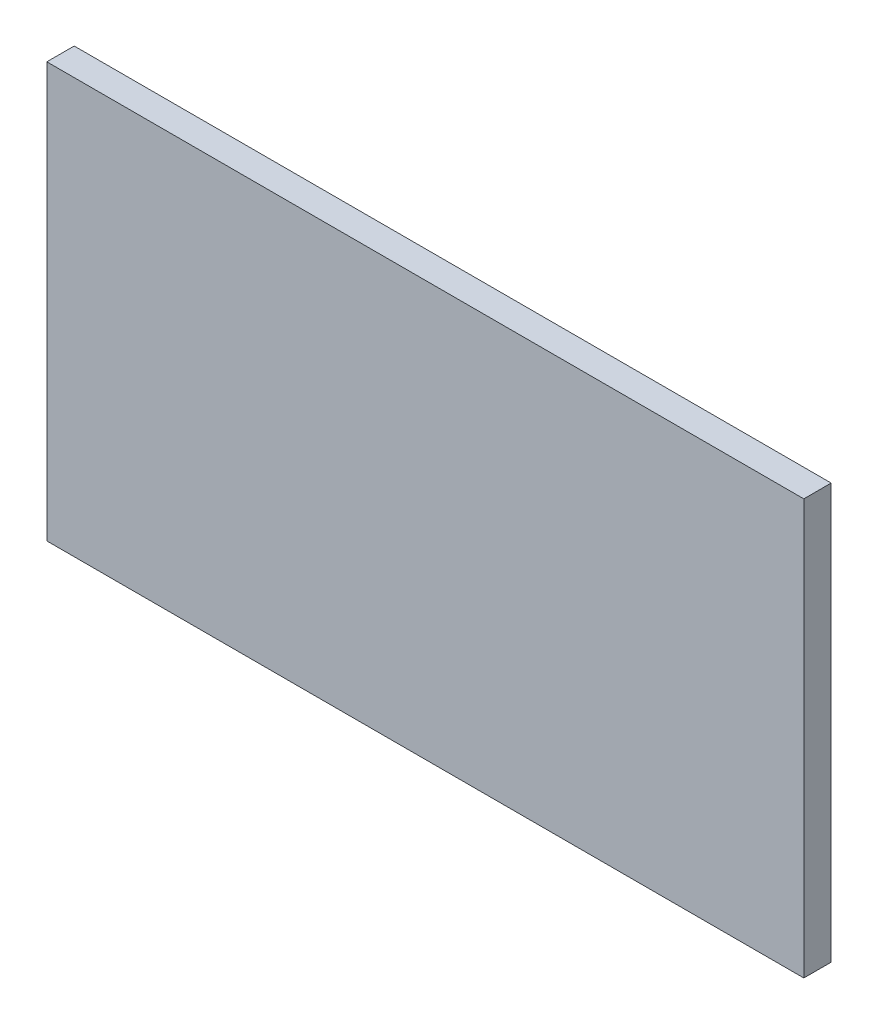
ISO-10303-21;
HEADER;
FILE_DESCRIPTION(('STEP AP214'),'2;1');
FILE_NAME('part.step','',(''),(''),'','','');
FILE_SCHEMA(('AUTOMOTIVE_DESIGN { 1 0 10303 214 1 1 1 1 }'));
ENDSEC;
DATA;
#1=APPLICATION_CONTEXT('core data for automotive mechanical design processes');
#2=APPLICATION_PROTOCOL_DEFINITION('international standard','automotive_design',2000,#1);
#3=PRODUCT_CONTEXT('',#1,'mechanical');
#4=PRODUCT('Part','Part','',(#3));
#5=PRODUCT_RELATED_PRODUCT_CATEGORY('part','',(#4));
#6=PRODUCT_DEFINITION_FORMATION('','',#4);
#7=PRODUCT_DEFINITION_CONTEXT('part definition',#1,'design');
#8=PRODUCT_DEFINITION('design','',#6,#7);
#9=PRODUCT_DEFINITION_SHAPE('','',#8);
#10=(LENGTH_UNIT() NAMED_UNIT(*) SI_UNIT(.MILLI.,.METRE.));
#11=(NAMED_UNIT(*) PLANE_ANGLE_UNIT() SI_UNIT($,.RADIAN.));
#12=(NAMED_UNIT(*) SI_UNIT($,.STERADIAN.) SOLID_ANGLE_UNIT());
#13=UNCERTAINTY_MEASURE_WITH_UNIT(LENGTH_MEASURE(1.E-05),#10,'distance_accuracy_value','');
#14=(GEOMETRIC_REPRESENTATION_CONTEXT(3) GLOBAL_UNCERTAINTY_ASSIGNED_CONTEXT((#13)) GLOBAL_UNIT_ASSIGNED_CONTEXT((#10,
#11,#12)) REPRESENTATION_CONTEXT('',''));
#15=CARTESIAN_POINT('',(0.,0.,0.));
#16=DIRECTION('',(0.,0.,1.));
#17=DIRECTION('',(1.,0.,0.));
#18=AXIS2_PLACEMENT_3D('',#15,#16,#17);
#19=CARTESIAN_POINT('',(23.25,6.79999999999998,-0.25));
#20=DIRECTION('',(0.,0.,1.));
#21=DIRECTION('',(1.,0.,0.));
#22=AXIS2_PLACEMENT_3D('',#19,#20,#21);
#23=CYLINDRICAL_SURFACE('',#22,0.650000000000001);
#24=CARTESIAN_POINT('',(23.25,6.79999999999998,-0.25));
#25=DIRECTION('',(0.,0.,-1.));
#26=DIRECTION('',(-1.,0.,0.));
#27=AXIS2_PLACEMENT_3D('',#24,#25,#26);
#28=CIRCLE('',#27,0.650000000000001);
#29=CARTESIAN_POINT('',(22.6,6.79999999999998,-0.25));
#30=VERTEX_POINT('',#29);
#31=EDGE_CURVE('E11',#30,#30,#28,.F.);
#32=ORIENTED_EDGE('',*,*,#31,.T.);
#33=EDGE_LOOP('',(#32));
#34=FACE_BOUND('',#33,.T.);
#35=CARTESIAN_POINT('',(23.25,6.79999999999998,0.));
#36=DIRECTION('',(0.,0.,-1.));
#37=DIRECTION('',(-1.,0.,0.));
#38=AXIS2_PLACEMENT_3D('',#35,#36,#37);
#39=CIRCLE('',#38,0.650000000000001);
#40=CARTESIAN_POINT('',(22.6,6.79999999999998,0.));
#41=VERTEX_POINT('',#40);
#42=EDGE_CURVE('E47',#41,#41,#39,.F.);
#43=ORIENTED_EDGE('',*,*,#42,.F.);
#44=EDGE_LOOP('',(#43));
#45=FACE_BOUND('',#44,.T.);
#46=ADVANCED_FACE('F44',(#34,#45),#23,.T.);
#47=CARTESIAN_POINT('',(0.,0.,-0.25));
#48=DIRECTION('',(0.,0.,-1.));
#49=DIRECTION('',(-1.,0.,0.));
#50=AXIS2_PLACEMENT_3D('',#47,#48,#49);
#51=PLANE('',#50);
#52=ORIENTED_EDGE('',*,*,#31,.F.);
#53=EDGE_LOOP('',(#52));
#54=FACE_BOUND('',#53,.T.);
#55=ADVANCED_FACE('F59',(#54),#51,.T.);
#56=CARTESIAN_POINT('',(0.,0.,0.));
#57=DIRECTION('',(0.,0.,-1.));
#58=DIRECTION('',(-1.,0.,0.));
#59=AXIS2_PLACEMENT_3D('',#56,#57,#58);
#60=PLANE('',#59);
#61=ORIENTED_EDGE('',*,*,#42,.T.);
#62=EDGE_LOOP('',(#61));
#63=FACE_BOUND('',#62,.T.);
#64=ADVANCED_FACE('F56',(#63),#60,.F.);
#65=CLOSED_SHELL('',(#46,#55,#64));
#66=MANIFOLD_SOLID_BREP('B2',#65);
#67=CARTESIAN_POINT('',(21.5,6.79999999999999,-0.25));
#68=DIRECTION('',(0.,0.,1.));
#69=DIRECTION('',(1.,0.,0.));
#70=AXIS2_PLACEMENT_3D('',#67,#68,#69);
#71=CYLINDRICAL_SURFACE('',#70,0.650000000000001);
#72=CARTESIAN_POINT('',(21.5,6.79999999999999,-0.25));
#73=DIRECTION('',(0.,0.,-1.));
#74=DIRECTION('',(-1.,0.,0.));
#75=AXIS2_PLACEMENT_3D('',#72,#73,#74);
#76=CIRCLE('',#75,0.650000000000001);
#77=CARTESIAN_POINT('',(20.85,6.79999999999999,-0.25));
#78=VERTEX_POINT('',#77);
#79=EDGE_CURVE('E43',#78,#78,#76,.F.);
#80=ORIENTED_EDGE('',*,*,#79,.T.);
#81=EDGE_LOOP('',(#80));
#82=FACE_BOUND('',#81,.T.);
#83=CARTESIAN_POINT('',(21.5,6.79999999999999,0.));
#84=DIRECTION('',(0.,0.,-1.));
#85=DIRECTION('',(-1.,0.,0.));
#86=AXIS2_PLACEMENT_3D('',#83,#84,#85);
#87=CIRCLE('',#86,0.650000000000001);
#88=CARTESIAN_POINT('',(20.85,6.79999999999999,0.));
#89=VERTEX_POINT('',#88);
#90=EDGE_CURVE('E96',#89,#89,#87,.F.);
#91=ORIENTED_EDGE('',*,*,#90,.F.);
#92=EDGE_LOOP('',(#91));
#93=FACE_BOUND('',#92,.T.);
#94=ADVANCED_FACE('F93',(#82,#93),#71,.T.);
#95=CARTESIAN_POINT('',(0.,0.,-0.25));
#96=DIRECTION('',(0.,0.,-1.));
#97=DIRECTION('',(-1.,0.,0.));
#98=AXIS2_PLACEMENT_3D('',#95,#96,#97);
#99=PLANE('',#98);
#100=ORIENTED_EDGE('',*,*,#79,.F.);
#101=EDGE_LOOP('',(#100));
#102=FACE_BOUND('',#101,.T.);
#103=ADVANCED_FACE('F108',(#102),#99,.T.);
#104=CARTESIAN_POINT('',(0.,0.,0.));
#105=DIRECTION('',(0.,0.,-1.));
#106=DIRECTION('',(-1.,0.,0.));
#107=AXIS2_PLACEMENT_3D('',#104,#105,#106);
#108=PLANE('',#107);
#109=ORIENTED_EDGE('',*,*,#90,.T.);
#110=EDGE_LOOP('',(#109));
#111=FACE_BOUND('',#110,.T.);
#112=ADVANCED_FACE('F105',(#111),#108,.F.);
#113=CLOSED_SHELL('',(#94,#103,#112));
#114=MANIFOLD_SOLID_BREP('B6',#113);
#115=CARTESIAN_POINT('',(21.5,5.04999999999999,-0.25));
#116=DIRECTION('',(0.,0.,1.));
#117=DIRECTION('',(1.,0.,0.));
#118=AXIS2_PLACEMENT_3D('',#115,#116,#117);
#119=CYLINDRICAL_SURFACE('',#118,0.650000000000001);
#120=CARTESIAN_POINT('',(21.5,5.04999999999999,-0.25));
#121=DIRECTION('',(0.,0.,-1.));
#122=DIRECTION('',(-1.,0.,0.));
#123=AXIS2_PLACEMENT_3D('',#120,#121,#122);
#124=CIRCLE('',#123,0.650000000000001);
#125=CARTESIAN_POINT('',(20.85,5.04999999999999,-0.25));
#126=VERTEX_POINT('',#125);
#127=EDGE_CURVE('E92',#126,#126,#124,.F.);
#128=ORIENTED_EDGE('',*,*,#127,.T.);
#129=EDGE_LOOP('',(#128));
#130=FACE_BOUND('',#129,.T.);
#131=CARTESIAN_POINT('',(21.5,5.04999999999999,0.));
#132=DIRECTION('',(0.,0.,-1.));
#133=DIRECTION('',(-1.,0.,0.));
#134=AXIS2_PLACEMENT_3D('',#131,#132,#133);
#135=CIRCLE('',#134,0.650000000000001);
#136=CARTESIAN_POINT('',(20.85,5.04999999999999,0.));
#137=VERTEX_POINT('',#136);
#138=EDGE_CURVE('E145',#137,#137,#135,.F.);
#139=ORIENTED_EDGE('',*,*,#138,.F.);
#140=EDGE_LOOP('',(#139));
#141=FACE_BOUND('',#140,.T.);
#142=ADVANCED_FACE('F142',(#130,#141),#119,.T.);
#143=CARTESIAN_POINT('',(0.,0.,-0.25));
#144=DIRECTION('',(0.,0.,-1.));
#145=DIRECTION('',(-1.,0.,0.));
#146=AXIS2_PLACEMENT_3D('',#143,#144,#145);
#147=PLANE('',#146);
#148=ORIENTED_EDGE('',*,*,#127,.F.);
#149=EDGE_LOOP('',(#148));
#150=FACE_BOUND('',#149,.T.);
#151=ADVANCED_FACE('F157',(#150),#147,.T.);
#152=CARTESIAN_POINT('',(0.,0.,0.));
#153=DIRECTION('',(0.,0.,-1.));
#154=DIRECTION('',(-1.,0.,0.));
#155=AXIS2_PLACEMENT_3D('',#152,#153,#154);
#156=PLANE('',#155);
#157=ORIENTED_EDGE('',*,*,#138,.T.);
#158=EDGE_LOOP('',(#157));
#159=FACE_BOUND('',#158,.T.);
#160=ADVANCED_FACE('F154',(#159),#156,.F.);
#161=CLOSED_SHELL('',(#142,#151,#160));
#162=MANIFOLD_SOLID_BREP('B38',#161);
#163=CARTESIAN_POINT('',(23.25,5.04999999999998,-0.25));
#164=DIRECTION('',(0.,0.,1.));
#165=DIRECTION('',(1.,0.,0.));
#166=AXIS2_PLACEMENT_3D('',#163,#164,#165);
#167=CYLINDRICAL_SURFACE('',#166,0.650000000000001);
#168=CARTESIAN_POINT('',(23.25,5.04999999999998,-0.25));
#169=DIRECTION('',(0.,0.,-1.));
#170=DIRECTION('',(-1.,0.,0.));
#171=AXIS2_PLACEMENT_3D('',#168,#169,#170);
#172=CIRCLE('',#171,0.650000000000001);
#173=CARTESIAN_POINT('',(22.6,5.04999999999998,-0.25));
#174=VERTEX_POINT('',#173);
#175=EDGE_CURVE('E141',#174,#174,#172,.F.);
#176=ORIENTED_EDGE('',*,*,#175,.T.);
#177=EDGE_LOOP('',(#176));
#178=FACE_BOUND('',#177,.T.);
#179=CARTESIAN_POINT('',(23.25,5.04999999999998,0.));
#180=DIRECTION('',(0.,0.,-1.));
#181=DIRECTION('',(-1.,0.,0.));
#182=AXIS2_PLACEMENT_3D('',#179,#180,#181);
#183=CIRCLE('',#182,0.650000000000001);
#184=CARTESIAN_POINT('',(22.6,5.04999999999998,0.));
#185=VERTEX_POINT('',#184);
#186=EDGE_CURVE('E194',#185,#185,#183,.F.);
#187=ORIENTED_EDGE('',*,*,#186,.F.);
#188=EDGE_LOOP('',(#187));
#189=FACE_BOUND('',#188,.T.);
#190=ADVANCED_FACE('F191',(#178,#189),#167,.T.);
#191=CARTESIAN_POINT('',(0.,0.,-0.25));
#192=DIRECTION('',(0.,0.,-1.));
#193=DIRECTION('',(-1.,0.,0.));
#194=AXIS2_PLACEMENT_3D('',#191,#192,#193);
#195=PLANE('',#194);
#196=ORIENTED_EDGE('',*,*,#175,.F.);
#197=EDGE_LOOP('',(#196));
#198=FACE_BOUND('',#197,.T.);
#199=ADVANCED_FACE('F206',(#198),#195,.T.);
#200=CARTESIAN_POINT('',(0.,0.,0.));
#201=DIRECTION('',(0.,0.,-1.));
#202=DIRECTION('',(-1.,0.,0.));
#203=AXIS2_PLACEMENT_3D('',#200,#201,#202);
#204=PLANE('',#203);
#205=ORIENTED_EDGE('',*,*,#186,.T.);
#206=EDGE_LOOP('',(#205));
#207=FACE_BOUND('',#206,.T.);
#208=ADVANCED_FACE('F203',(#207),#204,.F.);
#209=CLOSED_SHELL('',(#190,#199,#208));
#210=MANIFOLD_SOLID_BREP('B87',#209);
#211=CARTESIAN_POINT('',(23.25,3.29999999999998,-0.25));
#212=DIRECTION('',(0.,0.,1.));
#213=DIRECTION('',(1.,0.,0.));
#214=AXIS2_PLACEMENT_3D('',#211,#212,#213);
#215=CYLINDRICAL_SURFACE('',#214,0.650000000000001);
#216=CARTESIAN_POINT('',(23.25,3.29999999999998,-0.25));
#217=DIRECTION('',(0.,0.,-1.));
#218=DIRECTION('',(-1.,0.,0.));
#219=AXIS2_PLACEMENT_3D('',#216,#217,#218);
#220=CIRCLE('',#219,0.650000000000001);
#221=CARTESIAN_POINT('',(22.6,3.29999999999998,-0.25));
#222=VERTEX_POINT('',#221);
#223=EDGE_CURVE('E190',#222,#222,#220,.F.);
#224=ORIENTED_EDGE('',*,*,#223,.T.);
#225=EDGE_LOOP('',(#224));
#226=FACE_BOUND('',#225,.T.);
#227=CARTESIAN_POINT('',(23.25,3.29999999999998,0.));
#228=DIRECTION('',(0.,0.,-1.));
#229=DIRECTION('',(-1.,0.,0.));
#230=AXIS2_PLACEMENT_3D('',#227,#228,#229);
#231=CIRCLE('',#230,0.650000000000001);
#232=CARTESIAN_POINT('',(22.6,3.29999999999998,0.));
#233=VERTEX_POINT('',#232);
#234=EDGE_CURVE('E243',#233,#233,#231,.F.);
#235=ORIENTED_EDGE('',*,*,#234,.F.);
#236=EDGE_LOOP('',(#235));
#237=FACE_BOUND('',#236,.T.);
#238=ADVANCED_FACE('F240',(#226,#237),#215,.T.);
#239=CARTESIAN_POINT('',(0.,0.,-0.25));
#240=DIRECTION('',(0.,0.,-1.));
#241=DIRECTION('',(-1.,0.,0.));
#242=AXIS2_PLACEMENT_3D('',#239,#240,#241);
#243=PLANE('',#242);
#244=ORIENTED_EDGE('',*,*,#223,.F.);
#245=EDGE_LOOP('',(#244));
#246=FACE_BOUND('',#245,.T.);
#247=ADVANCED_FACE('F255',(#246),#243,.T.);
#248=CARTESIAN_POINT('',(0.,0.,0.));
#249=DIRECTION('',(0.,0.,-1.));
#250=DIRECTION('',(-1.,0.,0.));
#251=AXIS2_PLACEMENT_3D('',#248,#249,#250);
#252=PLANE('',#251);
#253=ORIENTED_EDGE('',*,*,#234,.T.);
#254=EDGE_LOOP('',(#253));
#255=FACE_BOUND('',#254,.T.);
#256=ADVANCED_FACE('F252',(#255),#252,.F.);
#257=CLOSED_SHELL('',(#238,#247,#256));
#258=MANIFOLD_SOLID_BREP('B136',#257);
#259=CARTESIAN_POINT('',(21.5,3.29999999999999,-0.25));
#260=DIRECTION('',(0.,0.,1.));
#261=DIRECTION('',(1.,0.,0.));
#262=AXIS2_PLACEMENT_3D('',#259,#260,#261);
#263=CYLINDRICAL_SURFACE('',#262,0.650000000000001);
#264=CARTESIAN_POINT('',(21.5,3.29999999999999,-0.25));
#265=DIRECTION('',(0.,0.,-1.));
#266=DIRECTION('',(-1.,0.,0.));
#267=AXIS2_PLACEMENT_3D('',#264,#265,#266);
#268=CIRCLE('',#267,0.650000000000001);
#269=CARTESIAN_POINT('',(20.85,3.29999999999999,-0.25));
#270=VERTEX_POINT('',#269);
#271=EDGE_CURVE('E239',#270,#270,#268,.F.);
#272=ORIENTED_EDGE('',*,*,#271,.T.);
#273=EDGE_LOOP('',(#272));
#274=FACE_BOUND('',#273,.T.);
#275=CARTESIAN_POINT('',(21.5,3.29999999999999,0.));
#276=DIRECTION('',(0.,0.,-1.));
#277=DIRECTION('',(-1.,0.,0.));
#278=AXIS2_PLACEMENT_3D('',#275,#276,#277);
#279=CIRCLE('',#278,0.650000000000001);
#280=CARTESIAN_POINT('',(20.85,3.29999999999999,0.));
#281=VERTEX_POINT('',#280);
#282=EDGE_CURVE('E293',#281,#281,#279,.F.);
#283=ORIENTED_EDGE('',*,*,#282,.F.);
#284=EDGE_LOOP('',(#283));
#285=FACE_BOUND('',#284,.T.);
#286=ADVANCED_FACE('F290',(#274,#285),#263,.T.);
#287=CARTESIAN_POINT('',(0.,0.,-0.25));
#288=DIRECTION('',(0.,0.,-1.));
#289=DIRECTION('',(-1.,0.,0.));
#290=AXIS2_PLACEMENT_3D('',#287,#288,#289);
#291=PLANE('',#290);
#292=ORIENTED_EDGE('',*,*,#271,.F.);
#293=EDGE_LOOP('',(#292));
#294=FACE_BOUND('',#293,.T.);
#295=ADVANCED_FACE('F305',(#294),#291,.T.);
#296=CARTESIAN_POINT('',(0.,0.,0.));
#297=DIRECTION('',(0.,0.,-1.));
#298=DIRECTION('',(-1.,0.,0.));
#299=AXIS2_PLACEMENT_3D('',#296,#297,#298);
#300=PLANE('',#299);
#301=ORIENTED_EDGE('',*,*,#282,.T.);
#302=EDGE_LOOP('',(#301));
#303=FACE_BOUND('',#302,.T.);
#304=ADVANCED_FACE('F302',(#303),#300,.F.);
#305=CLOSED_SHELL('',(#286,#295,#304));
#306=MANIFOLD_SOLID_BREP('B185',#305);
#307=CARTESIAN_POINT('',(0.,0.,0.));
#308=DIRECTION('',(0.,0.,-1.));
#309=DIRECTION('',(-1.,0.,0.));
#310=AXIS2_PLACEMENT_3D('',#307,#308,#309);
#311=PLANE('',#310);
#312=DIRECTION('',(0.,1.,0.));
#313=VECTOR('',#312,1.);
#314=CARTESIAN_POINT('',(0.,0.,0.));
#315=LINE('',#314,#313);
#316=CARTESIAN_POINT('',(0.,0.,0.));
#317=VERTEX_POINT('',#316);
#318=CARTESIAN_POINT('',(0.,22.75,0.));
#319=VERTEX_POINT('',#318);
#320=EDGE_CURVE('E413',#317,#319,#315,.T.);
#321=ORIENTED_EDGE('',*,*,#320,.T.);
#322=DIRECTION('',(1.,0.,0.));
#323=VECTOR('',#322,1.);
#324=CARTESIAN_POINT('',(0.,22.75,0.));
#325=LINE('',#324,#323);
#326=CARTESIAN_POINT('',(41.5,22.75,0.));
#327=VERTEX_POINT('',#326);
#328=EDGE_CURVE('E451',#319,#327,#325,.T.);
#329=ORIENTED_EDGE('',*,*,#328,.T.);
#330=DIRECTION('',(0.,1.,0.));
#331=VECTOR('',#330,1.);
#332=CARTESIAN_POINT('',(41.5,0.,0.));
#333=LINE('',#332,#331);
#334=CARTESIAN_POINT('',(41.5,0.,0.));
#335=VERTEX_POINT('',#334);
#336=EDGE_CURVE('E454',#335,#327,#333,.T.);
#337=ORIENTED_EDGE('',*,*,#336,.F.);
#338=DIRECTION('',(1.,0.,0.));
#339=VECTOR('',#338,1.);
#340=CARTESIAN_POINT('',(0.,0.,0.));
#341=LINE('',#340,#339);
#342=EDGE_CURVE('E441',#317,#335,#341,.T.);
#343=ORIENTED_EDGE('',*,*,#342,.F.);
#344=EDGE_LOOP('',(#321,#329,#337,#343));
#345=FACE_BOUND('',#344,.T.);
#346=DIRECTION('',(1.,0.,0.));
#347=VECTOR('',#346,1.);
#348=CARTESIAN_POINT('',(5.5,15.25,0.));
#349=LINE('',#348,#347);
#350=CARTESIAN_POINT('',(5.5,15.25,0.));
#351=VERTEX_POINT('',#350);
#352=CARTESIAN_POINT('',(9.26,15.25,0.));
#353=VERTEX_POINT('',#352);
#354=EDGE_CURVE('E411',#351,#353,#349,.T.);
#355=ORIENTED_EDGE('',*,*,#354,.F.);
#356=DIRECTION('',(0.,1.,0.));
#357=VECTOR('',#356,1.);
#358=CARTESIAN_POINT('',(5.5,12.25,0.));
#359=LINE('',#358,#357);
#360=CARTESIAN_POINT('',(5.5,12.25,0.));
#361=VERTEX_POINT('',#360);
#362=EDGE_CURVE('E417',#361,#351,#359,.T.);
#363=ORIENTED_EDGE('',*,*,#362,.F.);
#364=DIRECTION('',(-1.,0.,0.));
#365=VECTOR('',#364,1.);
#366=CARTESIAN_POINT('',(5.5,12.25,0.));
#367=LINE('',#366,#365);
#368=CARTESIAN_POINT('',(9.26,12.25,0.));
#369=VERTEX_POINT('',#368);
#370=EDGE_CURVE('E428',#369,#361,#367,.T.);
#371=ORIENTED_EDGE('',*,*,#370,.F.);
#372=DIRECTION('',(0.,-1.,0.));
#373=VECTOR('',#372,1.);
#374=CARTESIAN_POINT('',(9.26,12.25,0.));
#375=LINE('',#374,#373);
#376=EDGE_CURVE('E426',#353,#369,#375,.T.);
#377=ORIENTED_EDGE('',*,*,#376,.F.);
#378=EDGE_LOOP('',(#355,#363,#371,#377));
#379=FACE_BOUND('',#378,.T.);
#380=ADVANCED_FACE('F331',(#345,#379),#311,.T.);
#381=CARTESIAN_POINT('',(0.,0.,1.5));
#382=DIRECTION('',(-1.,0.,0.));
#383=DIRECTION('',(0.,0.,1.));
#384=AXIS2_PLACEMENT_3D('',#381,#382,#383);
#385=PLANE('',#384);
#386=ORIENTED_EDGE('',*,*,#320,.F.);
#387=DIRECTION('',(0.,0.,-1.));
#388=VECTOR('',#387,1.);
#389=CARTESIAN_POINT('',(0.,0.,1.5));
#390=LINE('',#389,#388);
#391=CARTESIAN_POINT('',(0.,0.,1.5));
#392=VERTEX_POINT('',#391);
#393=EDGE_CURVE('E458',#392,#317,#390,.T.);
#394=ORIENTED_EDGE('',*,*,#393,.F.);
#395=DIRECTION('',(0.,1.,0.));
#396=VECTOR('',#395,1.);
#397=CARTESIAN_POINT('',(0.,0.,1.5));
#398=LINE('',#397,#396);
#399=CARTESIAN_POINT('',(0.,22.75,1.5));
#400=VERTEX_POINT('',#399);
#401=EDGE_CURVE('E437',#392,#400,#398,.T.);
#402=ORIENTED_EDGE('',*,*,#401,.T.);
#403=DIRECTION('',(0.,0.,-1.));
#404=VECTOR('',#403,1.);
#405=CARTESIAN_POINT('',(0.,22.75,1.5));
#406=LINE('',#405,#404);
#407=EDGE_CURVE('E448',#400,#319,#406,.T.);
#408=ORIENTED_EDGE('',*,*,#407,.T.);
#409=EDGE_LOOP('',(#386,#394,#402,#408));
#410=FACE_BOUND('',#409,.T.);
#411=ADVANCED_FACE('F516',(#410),#385,.T.);
#412=CARTESIAN_POINT('',(0.,0.,1.5));
#413=DIRECTION('',(0.,1.,0.));
#414=DIRECTION('',(0.,0.,1.));
#415=AXIS2_PLACEMENT_3D('',#412,#413,#414);
#416=PLANE('',#415);
#417=ORIENTED_EDGE('',*,*,#342,.T.);
#418=DIRECTION('',(0.,0.,-1.));
#419=VECTOR('',#418,1.);
#420=CARTESIAN_POINT('',(41.5,0.,1.5));
#421=LINE('',#420,#419);
#422=CARTESIAN_POINT('',(41.5,0.,1.5));
#423=VERTEX_POINT('',#422);
#424=EDGE_CURVE('E461',#423,#335,#421,.T.);
#425=ORIENTED_EDGE('',*,*,#424,.F.);
#426=DIRECTION('',(1.,0.,0.));
#427=VECTOR('',#426,1.);
#428=CARTESIAN_POINT('',(0.,0.,1.5));
#429=LINE('',#428,#427);
#430=EDGE_CURVE('E446',#392,#423,#429,.T.);
#431=ORIENTED_EDGE('',*,*,#430,.F.);
#432=ORIENTED_EDGE('',*,*,#393,.T.);
#433=EDGE_LOOP('',(#417,#425,#431,#432));
#434=FACE_BOUND('',#433,.T.);
#435=ADVANCED_FACE('F522',(#434),#416,.F.);
#436=CARTESIAN_POINT('',(41.5,0.,1.5));
#437=DIRECTION('',(-1.,0.,0.));
#438=DIRECTION('',(0.,0.,1.));
#439=AXIS2_PLACEMENT_3D('',#436,#437,#438);
#440=PLANE('',#439);
#441=ORIENTED_EDGE('',*,*,#336,.T.);
#442=DIRECTION('',(0.,0.,-1.));
#443=VECTOR('',#442,1.);
#444=CARTESIAN_POINT('',(41.5,22.75,1.5));
#445=LINE('',#444,#443);
#446=CARTESIAN_POINT('',(41.5,22.75,1.5));
#447=VERTEX_POINT('',#446);
#448=EDGE_CURVE('E464',#447,#327,#445,.T.);
#449=ORIENTED_EDGE('',*,*,#448,.F.);
#450=DIRECTION('',(0.,1.,0.));
#451=VECTOR('',#450,1.);
#452=CARTESIAN_POINT('',(41.5,0.,1.5));
#453=LINE('',#452,#451);
#454=EDGE_CURVE('E444',#423,#447,#453,.T.);
#455=ORIENTED_EDGE('',*,*,#454,.F.);
#456=ORIENTED_EDGE('',*,*,#424,.T.);
#457=EDGE_LOOP('',(#441,#449,#455,#456));
#458=FACE_BOUND('',#457,.T.);
#459=ADVANCED_FACE('F531',(#458),#440,.F.);
#460=CARTESIAN_POINT('',(0.,22.75,1.5));
#461=DIRECTION('',(0.,1.,0.));
#462=DIRECTION('',(0.,0.,1.));
#463=AXIS2_PLACEMENT_3D('',#460,#461,#462);
#464=PLANE('',#463);
#465=ORIENTED_EDGE('',*,*,#328,.F.);
#466=ORIENTED_EDGE('',*,*,#407,.F.);
#467=DIRECTION('',(1.,0.,0.));
#468=VECTOR('',#467,1.);
#469=CARTESIAN_POINT('',(0.,22.75,1.5));
#470=LINE('',#469,#468);
#471=EDGE_CURVE('E440',#400,#447,#470,.T.);
#472=ORIENTED_EDGE('',*,*,#471,.T.);
#473=ORIENTED_EDGE('',*,*,#448,.T.);
#474=EDGE_LOOP('',(#465,#466,#472,#473));
#475=FACE_BOUND('',#474,.T.);
#476=ADVANCED_FACE('F535',(#475),#464,.T.);
#477=CARTESIAN_POINT('',(0.,0.,1.5));
#478=DIRECTION('',(0.,0.,-1.));
#479=DIRECTION('',(-1.,0.,0.));
#480=AXIS2_PLACEMENT_3D('',#477,#478,#479);
#481=PLANE('',#480);
#482=ORIENTED_EDGE('',*,*,#401,.F.);
#483=ORIENTED_EDGE('',*,*,#430,.T.);
#484=ORIENTED_EDGE('',*,*,#454,.T.);
#485=ORIENTED_EDGE('',*,*,#471,.F.);
#486=EDGE_LOOP('',(#482,#483,#484,#485));
#487=FACE_BOUND('',#486,.T.);
#488=ADVANCED_FACE('F527',(#487),#481,.F.);
#489=CARTESIAN_POINT('',(5.5,12.25,-1.1));
#490=DIRECTION('',(1.,0.,0.));
#491=DIRECTION('',(0.,0.,-1.));
#492=AXIS2_PLACEMENT_3D('',#489,#490,#491);
#493=PLANE('',#492);
#494=DIRECTION('',(0.,0.,1.));
#495=VECTOR('',#494,1.);
#496=CARTESIAN_POINT('',(5.5,15.25,-1.1));
#497=LINE('',#496,#495);
#498=CARTESIAN_POINT('',(5.5,15.25,-0.6));
#499=VERTEX_POINT('',#498);
#500=EDGE_CURVE('E407',#499,#351,#497,.T.);
#501=ORIENTED_EDGE('',*,*,#500,.F.);
#502=DIRECTION('',(0.,1.,0.));
#503=VECTOR('',#502,1.);
#504=CARTESIAN_POINT('',(5.5,12.25,-0.6));
#505=LINE('',#504,#503);
#506=CARTESIAN_POINT('',(5.5,12.25,-0.6));
#507=VERTEX_POINT('',#506);
#508=EDGE_CURVE('E340',#499,#507,#505,.F.);
#509=ORIENTED_EDGE('',*,*,#508,.T.);
#510=DIRECTION('',(0.,0.,1.));
#511=VECTOR('',#510,1.);
#512=CARTESIAN_POINT('',(5.5,12.25,-1.1));
#513=LINE('',#512,#511);
#514=EDGE_CURVE('E419',#507,#361,#513,.T.);
#515=ORIENTED_EDGE('',*,*,#514,.T.);
#516=ORIENTED_EDGE('',*,*,#362,.T.);
#517=EDGE_LOOP('',(#501,#509,#515,#516));
#518=FACE_BOUND('',#517,.T.);
#519=ADVANCED_FACE('F418',(#518),#493,.F.);
#520=CARTESIAN_POINT('',(5.5,15.25,-1.1));
#521=DIRECTION('',(0.,-1.,0.));
#522=DIRECTION('',(1.,0.,0.));
#523=AXIS2_PLACEMENT_3D('',#520,#521,#522);
#524=PLANE('',#523);
#525=DIRECTION('',(0.,0.,1.));
#526=VECTOR('',#525,1.);
#527=CARTESIAN_POINT('',(9.26,15.25,-1.1));
#528=LINE('',#527,#526);
#529=CARTESIAN_POINT('',(9.26,15.25,-0.6));
#530=VERTEX_POINT('',#529);
#531=EDGE_CURVE('E414',#530,#353,#528,.T.);
#532=ORIENTED_EDGE('',*,*,#531,.F.);
#533=DIRECTION('',(1.,0.,0.));
#534=VECTOR('',#533,1.);
#535=CARTESIAN_POINT('',(5.5,15.25,-0.6));
#536=LINE('',#535,#534);
#537=EDGE_CURVE('E355',#530,#499,#536,.F.);
#538=ORIENTED_EDGE('',*,*,#537,.T.);
#539=ORIENTED_EDGE('',*,*,#500,.T.);
#540=ORIENTED_EDGE('',*,*,#354,.T.);
#541=EDGE_LOOP('',(#532,#538,#539,#540));
#542=FACE_BOUND('',#541,.T.);
#543=ADVANCED_FACE('F409',(#542),#524,.F.);
#544=CARTESIAN_POINT('',(9.26,12.25,-1.1));
#545=DIRECTION('',(-1.,0.,0.));
#546=DIRECTION('',(0.,0.,1.));
#547=AXIS2_PLACEMENT_3D('',#544,#545,#546);
#548=PLANE('',#547);
#549=DIRECTION('',(0.,0.,1.));
#550=VECTOR('',#549,1.);
#551=CARTESIAN_POINT('',(9.26,12.25,-1.1));
#552=LINE('',#551,#550);
#553=CARTESIAN_POINT('',(9.26,12.25,-0.6));
#554=VERTEX_POINT('',#553);
#555=EDGE_CURVE('E434',#554,#369,#552,.T.);
#556=ORIENTED_EDGE('',*,*,#555,.F.);
#557=DIRECTION('',(0.,-1.,0.));
#558=VECTOR('',#557,1.);
#559=CARTESIAN_POINT('',(9.26,15.25,-0.6));
#560=LINE('',#559,#558);
#561=EDGE_CURVE('E475',#554,#530,#560,.F.);
#562=ORIENTED_EDGE('',*,*,#561,.T.);
#563=ORIENTED_EDGE('',*,*,#531,.T.);
#564=ORIENTED_EDGE('',*,*,#376,.T.);
#565=EDGE_LOOP('',(#556,#562,#563,#564));
#566=FACE_BOUND('',#565,.T.);
#567=ADVANCED_FACE('F560',(#566),#548,.F.);
#568=CARTESIAN_POINT('',(5.5,12.25,-1.1));
#569=DIRECTION('',(0.,1.,0.));
#570=DIRECTION('',(-1.,0.,0.));
#571=AXIS2_PLACEMENT_3D('',#568,#569,#570);
#572=PLANE('',#571);
#573=ORIENTED_EDGE('',*,*,#514,.F.);
#574=DIRECTION('',(-1.,0.,0.));
#575=VECTOR('',#574,1.);
#576=CARTESIAN_POINT('',(9.26,12.25,-0.6));
#577=LINE('',#576,#575);
#578=EDGE_CURVE('E288',#507,#554,#577,.F.);
#579=ORIENTED_EDGE('',*,*,#578,.T.);
#580=ORIENTED_EDGE('',*,*,#555,.T.);
#581=ORIENTED_EDGE('',*,*,#370,.T.);
#582=EDGE_LOOP('',(#573,#579,#580,#581));
#583=FACE_BOUND('',#582,.T.);
#584=ADVANCED_FACE('F512',(#583),#572,.F.);
#585=CARTESIAN_POINT('',(0.,0.,-1.1));
#586=DIRECTION('',(0.,0.,-1.));
#587=DIRECTION('',(-1.,0.,0.));
#588=AXIS2_PLACEMENT_3D('',#585,#586,#587);
#589=PLANE('',#588);
#590=DIRECTION('',(1.,0.,0.));
#591=VECTOR('',#590,1.);
#592=CARTESIAN_POINT('',(9.26,14.75,-1.1));
#593=LINE('',#592,#591);
#594=CARTESIAN_POINT('',(6.,14.75,-1.1));
#595=VERTEX_POINT('',#594);
#596=CARTESIAN_POINT('',(8.76,14.75,-1.1));
#597=VERTEX_POINT('',#596);
#598=EDGE_CURVE('E470',#595,#597,#593,.T.);
#599=ORIENTED_EDGE('',*,*,#598,.T.);
#600=DIRECTION('',(0.,-1.,0.));
#601=VECTOR('',#600,1.);
#602=CARTESIAN_POINT('',(8.76,12.25,-1.1));
#603=LINE('',#602,#601);
#604=CARTESIAN_POINT('',(8.76,12.75,-1.1));
#605=VERTEX_POINT('',#604);
#606=EDGE_CURVE('E472',#597,#605,#603,.T.);
#607=ORIENTED_EDGE('',*,*,#606,.T.);
#608=DIRECTION('',(-1.,0.,0.));
#609=VECTOR('',#608,1.);
#610=CARTESIAN_POINT('',(5.5,12.75,-1.1));
#611=LINE('',#610,#609);
#612=CARTESIAN_POINT('',(6.,12.75,-1.1));
#613=VERTEX_POINT('',#612);
#614=EDGE_CURVE('E460',#605,#613,#611,.T.);
#615=ORIENTED_EDGE('',*,*,#614,.T.);
#616=DIRECTION('',(0.,1.,0.));
#617=VECTOR('',#616,1.);
#618=CARTESIAN_POINT('',(6.,15.25,-1.1));
#619=LINE('',#618,#617);
#620=EDGE_CURVE('E468',#613,#595,#619,.T.);
#621=ORIENTED_EDGE('',*,*,#620,.T.);
#622=EDGE_LOOP('',(#599,#607,#615,#621));
#623=FACE_BOUND('',#622,.T.);
#624=CARTESIAN_POINT('',(8.08,13.75,-1.1));
#625=DIRECTION('',(0.,0.,-1.));
#626=DIRECTION('',(-1.,0.,0.));
#627=AXIS2_PLACEMENT_3D('',#624,#625,#626);
#628=CIRCLE('',#627,0.25);
#629=CARTESIAN_POINT('',(7.83,13.75,-1.1));
#630=VERTEX_POINT('',#629);
#631=EDGE_CURVE('E490',#630,#630,#628,.T.);
#632=ORIENTED_EDGE('',*,*,#631,.F.);
#633=EDGE_LOOP('',(#632));
#634=FACE_BOUND('',#633,.T.);
#635=ADVANCED_FACE('F505',(#623,#634),#589,.T.);
#636=CARTESIAN_POINT('',(8.08,13.75,-0.6));
#637=DIRECTION('',(0.,0.,-1.));
#638=DIRECTION('',(-1.,0.,0.));
#639=AXIS2_PLACEMENT_3D('',#636,#637,#638);
#640=CYLINDRICAL_SURFACE('',#639,0.25);
#641=CARTESIAN_POINT('',(8.08,13.75,-0.6));
#642=DIRECTION('',(0.,0.,-1.));
#643=DIRECTION('',(-1.,0.,0.));
#644=AXIS2_PLACEMENT_3D('',#641,#642,#643);
#645=CIRCLE('',#644,0.25);
#646=CARTESIAN_POINT('',(7.83,13.75,-0.6));
#647=VERTEX_POINT('',#646);
#648=EDGE_CURVE('E423',#647,#647,#645,.T.);
#649=ORIENTED_EDGE('',*,*,#648,.F.);
#650=EDGE_LOOP('',(#649));
#651=FACE_BOUND('',#650,.T.);
#652=ORIENTED_EDGE('',*,*,#631,.T.);
#653=EDGE_LOOP('',(#652));
#654=FACE_BOUND('',#653,.T.);
#655=ADVANCED_FACE('F503',(#651,#654),#640,.F.);
#656=CARTESIAN_POINT('',(8.08,13.75,-0.6));
#657=DIRECTION('',(0.,0.,-1.));
#658=DIRECTION('',(-1.,0.,0.));
#659=AXIS2_PLACEMENT_3D('',#656,#657,#658);
#660=PLANE('',#659);
#661=ORIENTED_EDGE('',*,*,#648,.T.);
#662=EDGE_LOOP('',(#661));
#663=FACE_BOUND('',#662,.T.);
#664=ADVANCED_FACE('F501',(#663),#660,.T.);
#665=CARTESIAN_POINT('',(6.,0.,-0.6));
#666=DIRECTION('',(0.,-1.,0.));
#667=DIRECTION('',(0.,0.,-1.));
#668=AXIS2_PLACEMENT_3D('',#665,#666,#667);
#669=CYLINDRICAL_SURFACE('',#668,0.5);
#670=CARTESIAN_POINT('',(6.,12.75,-0.6));
#671=DIRECTION('',(0.707106781186548,-0.707106781186547,0.));
#672=DIRECTION('',(0.707106781186547,0.707106781186548,0.));
#673=AXIS2_PLACEMENT_3D('',#670,#671,#672);
#674=ELLIPSE('',#673,0.707106781186548,0.5);
#675=EDGE_CURVE('E483',#507,#613,#674,.T.);
#676=ORIENTED_EDGE('',*,*,#675,.F.);
#677=ORIENTED_EDGE('',*,*,#508,.F.);
#678=CARTESIAN_POINT('',(6.,14.75,-0.6));
#679=DIRECTION('',(-0.707106781186547,-0.707106781186548,0.));
#680=DIRECTION('',(0.707106781186548,-0.707106781186547,0.));
#681=AXIS2_PLACEMENT_3D('',#678,#679,#680);
#682=ELLIPSE('',#681,0.707106781186547,0.5);
#683=EDGE_CURVE('E335',#595,#499,#682,.F.);
#684=ORIENTED_EDGE('',*,*,#683,.F.);
#685=ORIENTED_EDGE('',*,*,#620,.F.);
#686=EDGE_LOOP('',(#676,#677,#684,#685));
#687=FACE_BOUND('',#686,.T.);
#688=ADVANCED_FACE('F333',(#687),#669,.T.);
#689=CARTESIAN_POINT('',(0.,14.75,-0.6));
#690=DIRECTION('',(-1.,0.,0.));
#691=DIRECTION('',(0.,-1.,0.));
#692=AXIS2_PLACEMENT_3D('',#689,#690,#691);
#693=CYLINDRICAL_SURFACE('',#692,0.5);
#694=ORIENTED_EDGE('',*,*,#683,.T.);
#695=ORIENTED_EDGE('',*,*,#537,.F.);
#696=CARTESIAN_POINT('',(8.76,14.75,-0.6));
#697=DIRECTION('',(-0.707106781186548,0.707106781186547,0.));
#698=DIRECTION('',(-0.707106781186547,-0.707106781186548,0.));
#699=AXIS2_PLACEMENT_3D('',#696,#697,#698);
#700=ELLIPSE('',#699,0.707106781186548,0.5);
#701=EDGE_CURVE('E482',#597,#530,#700,.F.);
#702=ORIENTED_EDGE('',*,*,#701,.F.);
#703=ORIENTED_EDGE('',*,*,#598,.F.);
#704=EDGE_LOOP('',(#694,#695,#702,#703));
#705=FACE_BOUND('',#704,.T.);
#706=ADVANCED_FACE('F546',(#705),#693,.T.);
#707=CARTESIAN_POINT('',(0.,12.75,-0.6));
#708=DIRECTION('',(1.,0.,0.));
#709=DIRECTION('',(0.,1.,0.));
#710=AXIS2_PLACEMENT_3D('',#707,#708,#709);
#711=CYLINDRICAL_SURFACE('',#710,0.5);
#712=ORIENTED_EDGE('',*,*,#675,.T.);
#713=ORIENTED_EDGE('',*,*,#614,.F.);
#714=CARTESIAN_POINT('',(8.76,12.75,-0.6));
#715=DIRECTION('',(0.707106781186547,0.707106781186548,0.));
#716=DIRECTION('',(0.707106781186548,-0.707106781186547,0.));
#717=AXIS2_PLACEMENT_3D('',#714,#715,#716);
#718=ELLIPSE('',#717,0.707106781186547,0.5);
#719=EDGE_CURVE('E480',#554,#605,#718,.T.);
#720=ORIENTED_EDGE('',*,*,#719,.F.);
#721=ORIENTED_EDGE('',*,*,#578,.F.);
#722=EDGE_LOOP('',(#712,#713,#720,#721));
#723=FACE_BOUND('',#722,.T.);
#724=ADVANCED_FACE('F543',(#723),#711,.T.);
#725=CARTESIAN_POINT('',(8.76,0.,-0.6));
#726=DIRECTION('',(0.,1.,0.));
#727=DIRECTION('',(0.,0.,1.));
#728=AXIS2_PLACEMENT_3D('',#725,#726,#727);
#729=CYLINDRICAL_SURFACE('',#728,0.5);
#730=ORIENTED_EDGE('',*,*,#701,.T.);
#731=ORIENTED_EDGE('',*,*,#561,.F.);
#732=ORIENTED_EDGE('',*,*,#719,.T.);
#733=ORIENTED_EDGE('',*,*,#606,.F.);
#734=EDGE_LOOP('',(#730,#731,#732,#733));
#735=FACE_BOUND('',#734,.T.);
#736=ADVANCED_FACE('F540',(#735),#729,.T.);
#737=CLOSED_SHELL('',(#380,#411,#435,#459,#476,#488,#519,#543,#567,#584,#635,#655,#664,#688,
#706,#724,#736));
#738=MANIFOLD_SOLID_BREP('B234',#737);
#739=ADVANCED_BREP_SHAPE_REPRESENTATION('',(#18,#66,#114,#162,#210,#258,#306,#738),#14);
#740=SHAPE_DEFINITION_REPRESENTATION(#9,#739);
ENDSEC;
END-ISO-10303-21;
